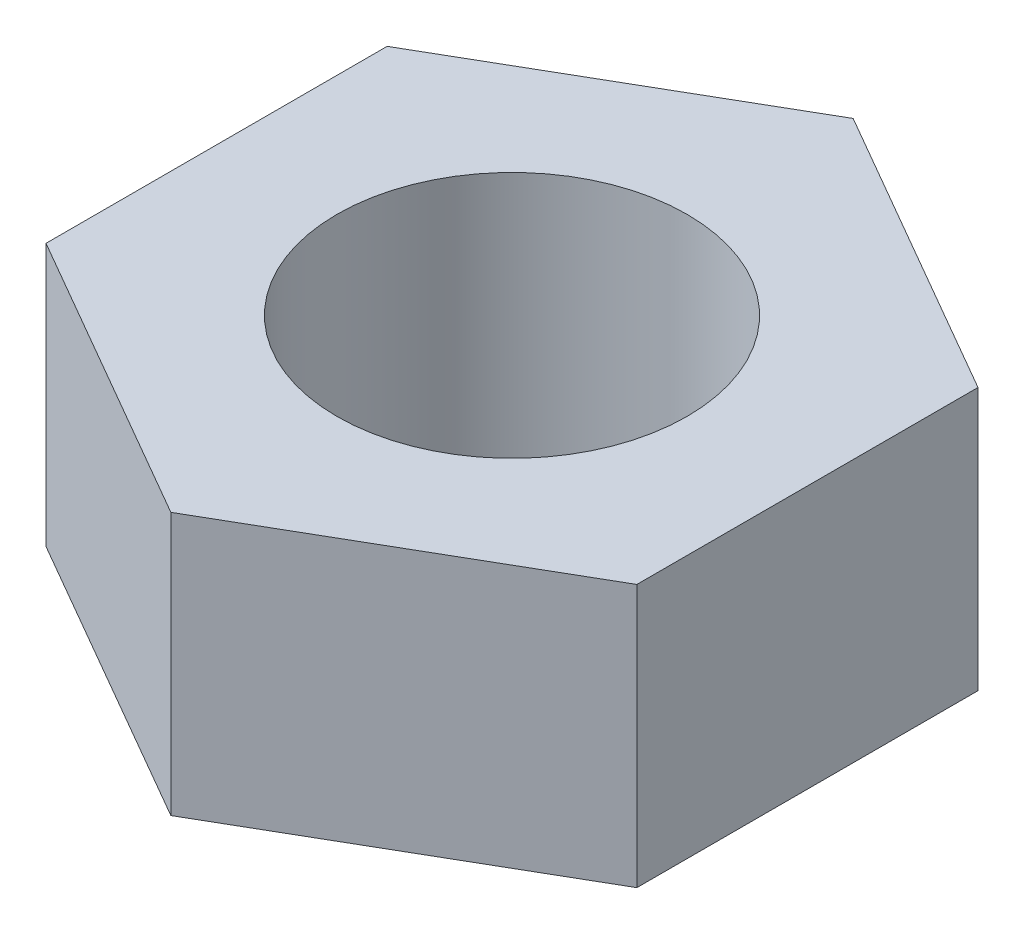
ISO-10303-21;
HEADER;
FILE_DESCRIPTION(('STEP AP214'),'2;1');
FILE_NAME('part.step','',(''),(''),'','','');
FILE_SCHEMA(('AUTOMOTIVE_DESIGN { 1 0 10303 214 1 1 1 1 }'));
ENDSEC;
DATA;
#1=APPLICATION_CONTEXT('core data for automotive mechanical design processes');
#2=APPLICATION_PROTOCOL_DEFINITION('international standard','automotive_design',2000,#1);
#3=PRODUCT_CONTEXT('',#1,'mechanical');
#4=PRODUCT('Part','Part','',(#3));
#5=PRODUCT_RELATED_PRODUCT_CATEGORY('part','',(#4));
#6=PRODUCT_DEFINITION_FORMATION('','',#4);
#7=PRODUCT_DEFINITION_CONTEXT('part definition',#1,'design');
#8=PRODUCT_DEFINITION('design','',#6,#7);
#9=PRODUCT_DEFINITION_SHAPE('','',#8);
#10=(LENGTH_UNIT() NAMED_UNIT(*) SI_UNIT(.MILLI.,.METRE.));
#11=(NAMED_UNIT(*) PLANE_ANGLE_UNIT() SI_UNIT($,.RADIAN.));
#12=(NAMED_UNIT(*) SI_UNIT($,.STERADIAN.) SOLID_ANGLE_UNIT());
#13=UNCERTAINTY_MEASURE_WITH_UNIT(LENGTH_MEASURE(1.E-05),#10,'distance_accuracy_value','');
#14=(GEOMETRIC_REPRESENTATION_CONTEXT(3) GLOBAL_UNCERTAINTY_ASSIGNED_CONTEXT((#13)) GLOBAL_UNIT_ASSIGNED_CONTEXT((#10,
#11,#12)) REPRESENTATION_CONTEXT('',''));
#15=CARTESIAN_POINT('',(0.,0.,0.));
#16=DIRECTION('',(0.,0.,1.));
#17=DIRECTION('',(1.,0.,0.));
#18=AXIS2_PLACEMENT_3D('',#15,#16,#17);
#19=CARTESIAN_POINT('',(0.,6.,0.));
#20=DIRECTION('',(0.,1.,0.));
#21=DIRECTION('',(0.,0.,1.));
#22=AXIS2_PLACEMENT_3D('',#19,#20,#21);
#23=PLANE('',#22);
#24=DIRECTION('',(-0.866025403784441,0.,-0.499999999999995));
#25=VECTOR('',#24,1.);
#26=CARTESIAN_POINT('',(6.74999999999996,6.,-3.89711431703006));
#27=LINE('',#26,#25);
#28=CARTESIAN_POINT('',(6.74999999999996,6.,-3.89711431703006));
#29=VERTEX_POINT('',#28);
#30=CARTESIAN_POINT('',(0.,6.,-7.79422863405996));
#31=VERTEX_POINT('',#30);
#32=EDGE_CURVE('E132',#29,#31,#27,.T.);
#33=ORIENTED_EDGE('',*,*,#32,.T.);
#34=DIRECTION('',(-0.866025403784438,0.,0.500000000000001));
#35=VECTOR('',#34,1.);
#36=CARTESIAN_POINT('',(0.,6.,-7.79422863405996));
#37=LINE('',#36,#35);
#38=CARTESIAN_POINT('',(-6.75000000000002,6.,-3.89711431702996));
#39=VERTEX_POINT('',#38);
#40=EDGE_CURVE('E90',#31,#39,#37,.T.);
#41=ORIENTED_EDGE('',*,*,#40,.T.);
#42=DIRECTION('',(0.,0.,1.));
#43=VECTOR('',#42,1.);
#44=CARTESIAN_POINT('',(-6.75000000000002,6.,-3.89711431702996));
#45=LINE('',#44,#43);
#46=CARTESIAN_POINT('',(-6.74999999999999,6.,3.89711431703001));
#47=VERTEX_POINT('',#46);
#48=EDGE_CURVE('E103',#39,#47,#45,.T.);
#49=ORIENTED_EDGE('',*,*,#48,.T.);
#50=DIRECTION('',(0.866025403784441,0.,0.499999999999995));
#51=VECTOR('',#50,1.);
#52=CARTESIAN_POINT('',(-6.74999999999999,6.,3.89711431703001));
#53=LINE('',#52,#51);
#54=CARTESIAN_POINT('',(0.,6.,7.79422863405995));
#55=VERTEX_POINT('',#54);
#56=EDGE_CURVE('E97',#47,#55,#53,.T.);
#57=ORIENTED_EDGE('',*,*,#56,.T.);
#58=DIRECTION('',(0.866025403784435,0.,-0.500000000000007));
#59=VECTOR('',#58,1.);
#60=CARTESIAN_POINT('',(0.,6.,7.79422863405995));
#61=LINE('',#60,#59);
#62=CARTESIAN_POINT('',(6.75000000000004,6.,3.89711431702991));
#63=VERTEX_POINT('',#62);
#64=EDGE_CURVE('E101',#55,#63,#61,.T.);
#65=ORIENTED_EDGE('',*,*,#64,.T.);
#66=DIRECTION('',(0.,0.,-1.));
#67=VECTOR('',#66,1.);
#68=CARTESIAN_POINT('',(6.75000000000004,6.,3.89711431702991));
#69=LINE('',#68,#67);
#70=EDGE_CURVE('E53',#63,#29,#69,.T.);
#71=ORIENTED_EDGE('',*,*,#70,.T.);
#72=EDGE_LOOP('',(#33,#41,#49,#57,#65,#71));
#73=FACE_BOUND('',#72,.T.);
#74=CARTESIAN_POINT('',(0.,6.,0.));
#75=DIRECTION('',(0.,1.,0.));
#76=DIRECTION('',(0.,0.,1.));
#77=AXIS2_PLACEMENT_3D('',#74,#75,#76);
#78=CIRCLE('',#77,4.);
#79=CARTESIAN_POINT('',(0.,6.,4.));
#80=VERTEX_POINT('',#79);
#81=EDGE_CURVE('E125',#80,#80,#78,.T.);
#82=ORIENTED_EDGE('',*,*,#81,.F.);
#83=EDGE_LOOP('',(#82));
#84=FACE_BOUND('',#83,.T.);
#85=ADVANCED_FACE('F36',(#73,#84),#23,.T.);
#86=CARTESIAN_POINT('',(0.,0.,0.));
#87=DIRECTION('',(0.,1.,0.));
#88=DIRECTION('',(0.,0.,1.));
#89=AXIS2_PLACEMENT_3D('',#86,#87,#88);
#90=PLANE('',#89);
#91=DIRECTION('',(-0.866025403784441,0.,-0.499999999999995));
#92=VECTOR('',#91,1.);
#93=CARTESIAN_POINT('',(6.74999999999996,0.,-3.89711431703006));
#94=LINE('',#93,#92);
#95=CARTESIAN_POINT('',(6.74999999999996,0.,-3.89711431703006));
#96=VERTEX_POINT('',#95);
#97=CARTESIAN_POINT('',(0.,0.,-7.79422863405996));
#98=VERTEX_POINT('',#97);
#99=EDGE_CURVE('E121',#96,#98,#94,.T.);
#100=ORIENTED_EDGE('',*,*,#99,.F.);
#101=DIRECTION('',(0.,0.,-1.));
#102=VECTOR('',#101,1.);
#103=CARTESIAN_POINT('',(6.75000000000004,0.,3.89711431702991));
#104=LINE('',#103,#102);
#105=CARTESIAN_POINT('',(6.75000000000004,0.,3.89711431702991));
#106=VERTEX_POINT('',#105);
#107=EDGE_CURVE('E82',#106,#96,#104,.T.);
#108=ORIENTED_EDGE('',*,*,#107,.F.);
#109=DIRECTION('',(0.866025403784435,0.,-0.500000000000007));
#110=VECTOR('',#109,1.);
#111=CARTESIAN_POINT('',(0.,0.,7.79422863405995));
#112=LINE('',#111,#110);
#113=CARTESIAN_POINT('',(0.,0.,7.79422863405995));
#114=VERTEX_POINT('',#113);
#115=EDGE_CURVE('E76',#114,#106,#112,.T.);
#116=ORIENTED_EDGE('',*,*,#115,.F.);
#117=DIRECTION('',(0.866025403784441,0.,0.499999999999995));
#118=VECTOR('',#117,1.);
#119=CARTESIAN_POINT('',(-6.74999999999999,0.,3.89711431703001));
#120=LINE('',#119,#118);
#121=CARTESIAN_POINT('',(-6.74999999999999,0.,3.89711431703001));
#122=VERTEX_POINT('',#121);
#123=EDGE_CURVE('E111',#122,#114,#120,.T.);
#124=ORIENTED_EDGE('',*,*,#123,.F.);
#125=DIRECTION('',(0.,0.,1.));
#126=VECTOR('',#125,1.);
#127=CARTESIAN_POINT('',(-6.75000000000002,0.,-3.89711431702996));
#128=LINE('',#127,#126);
#129=CARTESIAN_POINT('',(-6.75000000000002,0.,-3.89711431702996));
#130=VERTEX_POINT('',#129);
#131=EDGE_CURVE('E127',#130,#122,#128,.T.);
#132=ORIENTED_EDGE('',*,*,#131,.F.);
#133=DIRECTION('',(-0.866025403784438,0.,0.500000000000001));
#134=VECTOR('',#133,1.);
#135=CARTESIAN_POINT('',(0.,0.,-7.79422863405996));
#136=LINE('',#135,#134);
#137=EDGE_CURVE('E124',#98,#130,#136,.T.);
#138=ORIENTED_EDGE('',*,*,#137,.F.);
#139=EDGE_LOOP('',(#100,#108,#116,#124,#132,#138));
#140=FACE_BOUND('',#139,.T.);
#141=CARTESIAN_POINT('',(0.,0.,0.));
#142=DIRECTION('',(0.,1.,0.));
#143=DIRECTION('',(0.,0.,1.));
#144=AXIS2_PLACEMENT_3D('',#141,#142,#143);
#145=CIRCLE('',#144,4.);
#146=CARTESIAN_POINT('',(0.,0.,4.));
#147=VERTEX_POINT('',#146);
#148=EDGE_CURVE('E225',#147,#147,#145,.T.);
#149=ORIENTED_EDGE('',*,*,#148,.T.);
#150=EDGE_LOOP('',(#149));
#151=FACE_BOUND('',#150,.T.);
#152=ADVANCED_FACE('F141',(#140,#151),#90,.F.);
#153=CARTESIAN_POINT('',(6.74999999999996,6.,-3.89711431703006));
#154=DIRECTION('',(-0.499999999999995,0.,0.866025403784441));
#155=DIRECTION('',(0.866025403784441,0.,0.499999999999995));
#156=AXIS2_PLACEMENT_3D('',#153,#154,#155);
#157=PLANE('',#156);
#158=ORIENTED_EDGE('',*,*,#99,.T.);
#159=DIRECTION('',(0.,-1.,0.));
#160=VECTOR('',#159,1.);
#161=CARTESIAN_POINT('',(0.,6.,-7.79422863405996));
#162=LINE('',#161,#160);
#163=EDGE_CURVE('E11',#31,#98,#162,.T.);
#164=ORIENTED_EDGE('',*,*,#163,.F.);
#165=ORIENTED_EDGE('',*,*,#32,.F.);
#166=DIRECTION('',(0.,-1.,0.));
#167=VECTOR('',#166,1.);
#168=CARTESIAN_POINT('',(6.74999999999996,6.,-3.89711431703006));
#169=LINE('',#168,#167);
#170=EDGE_CURVE('E117',#29,#96,#169,.T.);
#171=ORIENTED_EDGE('',*,*,#170,.T.);
#172=EDGE_LOOP('',(#158,#164,#165,#171));
#173=FACE_BOUND('',#172,.T.);
#174=ADVANCED_FACE('F38',(#173),#157,.F.);
#175=CARTESIAN_POINT('',(0.,6.,-7.79422863405996));
#176=DIRECTION('',(0.500000000000001,0.,0.866025403784438));
#177=DIRECTION('',(0.866025403784438,0.,-0.500000000000001));
#178=AXIS2_PLACEMENT_3D('',#175,#176,#177);
#179=PLANE('',#178);
#180=ORIENTED_EDGE('',*,*,#137,.T.);
#181=DIRECTION('',(0.,-1.,0.));
#182=VECTOR('',#181,1.);
#183=CARTESIAN_POINT('',(-6.75000000000002,6.,-3.89711431702996));
#184=LINE('',#183,#182);
#185=EDGE_CURVE('E45',#39,#130,#184,.T.);
#186=ORIENTED_EDGE('',*,*,#185,.F.);
#187=ORIENTED_EDGE('',*,*,#40,.F.);
#188=ORIENTED_EDGE('',*,*,#163,.T.);
#189=EDGE_LOOP('',(#180,#186,#187,#188));
#190=FACE_BOUND('',#189,.T.);
#191=ADVANCED_FACE('F166',(#190),#179,.F.);
#192=CARTESIAN_POINT('',(-6.75000000000002,6.,-3.89711431702996));
#193=DIRECTION('',(1.,0.,0.));
#194=DIRECTION('',(0.,0.,-1.));
#195=AXIS2_PLACEMENT_3D('',#192,#193,#194);
#196=PLANE('',#195);
#197=ORIENTED_EDGE('',*,*,#131,.T.);
#198=DIRECTION('',(0.,-1.,0.));
#199=VECTOR('',#198,1.);
#200=CARTESIAN_POINT('',(-6.74999999999999,6.,3.89711431703001));
#201=LINE('',#200,#199);
#202=EDGE_CURVE('E112',#47,#122,#201,.T.);
#203=ORIENTED_EDGE('',*,*,#202,.F.);
#204=ORIENTED_EDGE('',*,*,#48,.F.);
#205=ORIENTED_EDGE('',*,*,#185,.T.);
#206=EDGE_LOOP('',(#197,#203,#204,#205));
#207=FACE_BOUND('',#206,.T.);
#208=ADVANCED_FACE('F138',(#207),#196,.F.);
#209=CARTESIAN_POINT('',(-6.74999999999999,6.,3.89711431703001));
#210=DIRECTION('',(0.499999999999995,0.,-0.866025403784442));
#211=DIRECTION('',(-0.866025403784442,0.,-0.499999999999995));
#212=AXIS2_PLACEMENT_3D('',#209,#210,#211);
#213=PLANE('',#212);
#214=ORIENTED_EDGE('',*,*,#123,.T.);
#215=DIRECTION('',(0.,-1.,0.));
#216=VECTOR('',#215,1.);
#217=CARTESIAN_POINT('',(0.,6.,7.79422863405995));
#218=LINE('',#217,#216);
#219=EDGE_CURVE('E108',#55,#114,#218,.T.);
#220=ORIENTED_EDGE('',*,*,#219,.F.);
#221=ORIENTED_EDGE('',*,*,#56,.F.);
#222=ORIENTED_EDGE('',*,*,#202,.T.);
#223=EDGE_LOOP('',(#214,#220,#221,#222));
#224=FACE_BOUND('',#223,.T.);
#225=ADVANCED_FACE('F109',(#224),#213,.F.);
#226=CARTESIAN_POINT('',(0.,6.,7.79422863405995));
#227=DIRECTION('',(-0.500000000000007,0.,-0.866025403784434));
#228=DIRECTION('',(-0.866025403784435,0.,0.500000000000007));
#229=AXIS2_PLACEMENT_3D('',#226,#227,#228);
#230=PLANE('',#229);
#231=ORIENTED_EDGE('',*,*,#115,.T.);
#232=DIRECTION('',(0.,-1.,0.));
#233=VECTOR('',#232,1.);
#234=CARTESIAN_POINT('',(6.75000000000004,6.,3.89711431702991));
#235=LINE('',#234,#233);
#236=EDGE_CURVE('E113',#63,#106,#235,.T.);
#237=ORIENTED_EDGE('',*,*,#236,.F.);
#238=ORIENTED_EDGE('',*,*,#64,.F.);
#239=ORIENTED_EDGE('',*,*,#219,.T.);
#240=EDGE_LOOP('',(#231,#237,#238,#239));
#241=FACE_BOUND('',#240,.T.);
#242=ADVANCED_FACE('F115',(#241),#230,.F.);
#243=CARTESIAN_POINT('',(6.75000000000004,6.,3.89711431702991));
#244=DIRECTION('',(-1.,0.,0.));
#245=DIRECTION('',(0.,0.,1.));
#246=AXIS2_PLACEMENT_3D('',#243,#244,#245);
#247=PLANE('',#246);
#248=ORIENTED_EDGE('',*,*,#107,.T.);
#249=ORIENTED_EDGE('',*,*,#170,.F.);
#250=ORIENTED_EDGE('',*,*,#70,.F.);
#251=ORIENTED_EDGE('',*,*,#236,.T.);
#252=EDGE_LOOP('',(#248,#249,#250,#251));
#253=FACE_BOUND('',#252,.T.);
#254=ADVANCED_FACE('F146',(#253),#247,.F.);
#255=CARTESIAN_POINT('',(0.,6.,0.));
#256=DIRECTION('',(0.,-1.,0.));
#257=DIRECTION('',(0.,0.,-1.));
#258=AXIS2_PLACEMENT_3D('',#255,#256,#257);
#259=CYLINDRICAL_SURFACE('',#258,4.);
#260=ORIENTED_EDGE('',*,*,#81,.T.);
#261=EDGE_LOOP('',(#260));
#262=FACE_BOUND('',#261,.T.);
#263=ORIENTED_EDGE('',*,*,#148,.F.);
#264=EDGE_LOOP('',(#263));
#265=FACE_BOUND('',#264,.T.);
#266=ADVANCED_FACE('F148',(#262,#265),#259,.F.);
#267=CLOSED_SHELL('',(#85,#152,#174,#191,#208,#225,#242,#254,#266));
#268=MANIFOLD_SOLID_BREP('B2',#267);
#269=ADVANCED_BREP_SHAPE_REPRESENTATION('',(#18,#268),#14);
#270=SHAPE_DEFINITION_REPRESENTATION(#9,#269);
ENDSEC;
END-ISO-10303-21;
